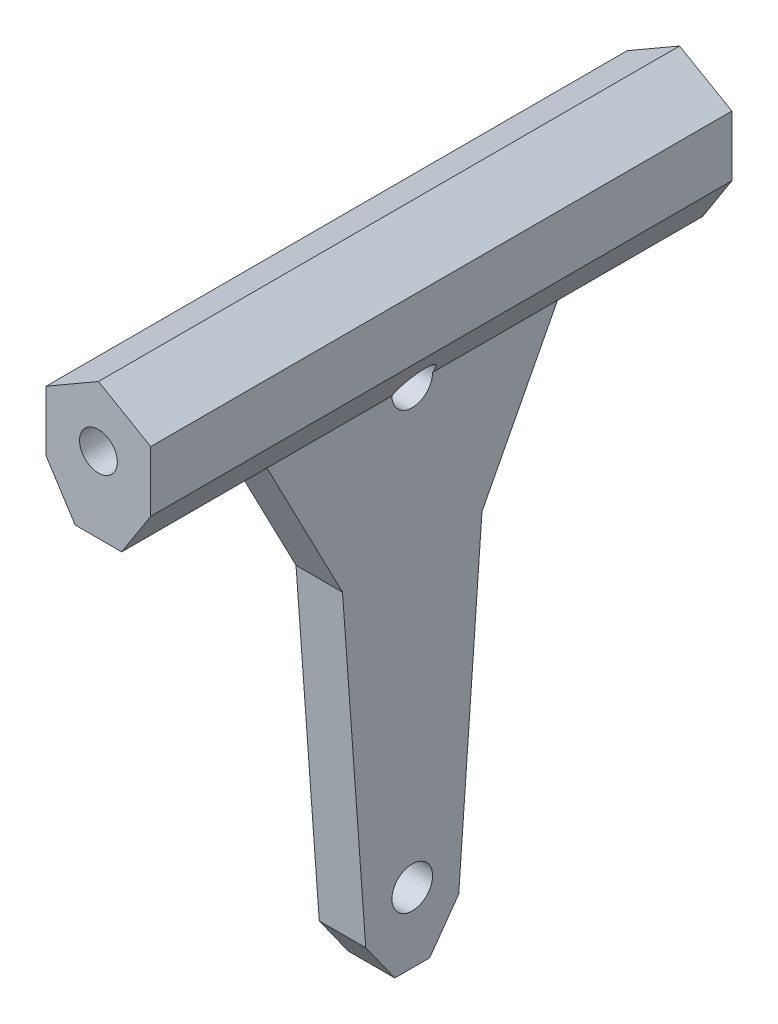
ISO-10303-21;
HEADER;
FILE_DESCRIPTION(('STEP AP214'),'2;1');
FILE_NAME('part.step','',(''),(''),'','','');
FILE_SCHEMA(('AUTOMOTIVE_DESIGN { 1 0 10303 214 1 1 1 1 }'));
ENDSEC;
DATA;
#1=APPLICATION_CONTEXT('core data for automotive mechanical design processes');
#2=APPLICATION_PROTOCOL_DEFINITION('international standard','automotive_design',2000,#1);
#3=PRODUCT_CONTEXT('',#1,'mechanical');
#4=PRODUCT('Part','Part','',(#3));
#5=PRODUCT_RELATED_PRODUCT_CATEGORY('part','',(#4));
#6=PRODUCT_DEFINITION_FORMATION('','',#4);
#7=PRODUCT_DEFINITION_CONTEXT('part definition',#1,'design');
#8=PRODUCT_DEFINITION('design','',#6,#7);
#9=PRODUCT_DEFINITION_SHAPE('','',#8);
#10=(LENGTH_UNIT() NAMED_UNIT(*) SI_UNIT(.MILLI.,.METRE.));
#11=(NAMED_UNIT(*) PLANE_ANGLE_UNIT() SI_UNIT($,.RADIAN.));
#12=(NAMED_UNIT(*) SI_UNIT($,.STERADIAN.) SOLID_ANGLE_UNIT());
#13=UNCERTAINTY_MEASURE_WITH_UNIT(LENGTH_MEASURE(1.E-05),#10,'distance_accuracy_value','');
#14=(GEOMETRIC_REPRESENTATION_CONTEXT(3) GLOBAL_UNCERTAINTY_ASSIGNED_CONTEXT((#13)) GLOBAL_UNIT_ASSIGNED_CONTEXT((#10,
#11,#12)) REPRESENTATION_CONTEXT('',''));
#15=CARTESIAN_POINT('',(0.,0.,0.));
#16=DIRECTION('',(0.,0.,1.));
#17=DIRECTION('',(1.,0.,0.));
#18=AXIS2_PLACEMENT_3D('',#15,#16,#17);
#19=CARTESIAN_POINT('',(-4.,-13.,100.));
#20=DIRECTION('',(1.,0.,0.));
#21=DIRECTION('',(0.,1.,0.));
#22=AXIS2_PLACEMENT_3D('',#19,#20,#21);
#23=PLANE('',#22);
#24=CARTESIAN_POINT('',(-3.99999999999999,-88.,50.));
#25=DIRECTION('',(1.,0.,0.));
#26=DIRECTION('',(0.,1.,0.));
#27=AXIS2_PLACEMENT_3D('',#24,#25,#26);
#28=CIRCLE('',#27,3.5);
#29=CARTESIAN_POINT('',(-3.99999999999999,-91.5,50.));
#30=VERTEX_POINT('',#29);
#31=EDGE_CURVE('E590',#30,#30,#28,.T.);
#32=ORIENTED_EDGE('',*,*,#31,.T.);
#33=EDGE_LOOP('',(#32));
#34=FACE_BOUND('',#33,.T.);
#35=DIRECTION('',(0.,0.,-1.));
#36=VECTOR('',#35,1.);
#37=CARTESIAN_POINT('',(-4.,-13.,100.));
#38=LINE('',#37,#36);
#39=CARTESIAN_POINT('',(-3.99999999999999,-13.,75.));
#40=VERTEX_POINT('',#39);
#41=CARTESIAN_POINT('',(-4.,-13.,53.5));
#42=VERTEX_POINT('',#41);
#43=EDGE_CURVE('E510',#40,#42,#38,.T.);
#44=ORIENTED_EDGE('',*,*,#43,.T.);
#45=CARTESIAN_POINT('',(-4.,-13.,50.));
#46=DIRECTION('',(1.,0.,0.));
#47=DIRECTION('',(0.,1.,0.));
#48=AXIS2_PLACEMENT_3D('',#45,#46,#47);
#49=CIRCLE('',#48,3.5);
#50=CARTESIAN_POINT('',(-4.,-13.,46.5));
#51=VERTEX_POINT('',#50);
#52=EDGE_CURVE('E576',#42,#51,#49,.T.);
#53=ORIENTED_EDGE('',*,*,#52,.T.);
#54=CARTESIAN_POINT('',(-3.99999999999999,-13.,25.));
#55=VERTEX_POINT('',#54);
#56=EDGE_CURVE('E507',#51,#55,#38,.T.);
#57=ORIENTED_EDGE('',*,*,#56,.T.);
#58=DIRECTION('',(0.,0.887216801234595,-0.46135273664199));
#59=VECTOR('',#58,1.);
#60=CARTESIAN_POINT('',(-3.99999999999999,-43.6989924433249,40.963476070529));
#61=LINE('',#60,#59);
#62=CARTESIAN_POINT('',(-3.99999999999999,-38.,38.));
#63=VERTEX_POINT('',#62);
#64=EDGE_CURVE('E581',#63,#55,#61,.T.);
#65=ORIENTED_EDGE('',*,*,#64,.F.);
#66=DIRECTION('',(0.,0.997365816958794,-0.0725356957788213));
#67=VECTOR('',#66,1.);
#68=CARTESIAN_POINT('',(-4.,-17.6169023347583,36.5175928970733));
#69=LINE('',#68,#67);
#70=CARTESIAN_POINT('',(-3.99999999999999,-93.,42.));
#71=VERTEX_POINT('',#70);
#72=EDGE_CURVE('E579',#71,#63,#69,.T.);
#73=ORIENTED_EDGE('',*,*,#72,.F.);
#74=DIRECTION('',(0.,0.813733471206736,-0.581238193719095));
#75=VECTOR('',#74,1.);
#76=CARTESIAN_POINT('',(-3.99999999999999,-67.4594594594593,23.7567567567567));
#77=LINE('',#76,#75);
#78=CARTESIAN_POINT('',(-3.99999999999998,-100.,47.));
#79=VERTEX_POINT('',#78);
#80=EDGE_CURVE('E588',#79,#71,#77,.T.);
#81=ORIENTED_EDGE('',*,*,#80,.F.);
#82=DIRECTION('',(0.,0.,-1.));
#83=VECTOR('',#82,1.);
#84=CARTESIAN_POINT('',(-3.99999999999999,-100.,100.));
#85=LINE('',#84,#83);
#86=CARTESIAN_POINT('',(-3.99999999999998,-100.,53.));
#87=VERTEX_POINT('',#86);
#88=EDGE_CURVE('E504',#87,#79,#85,.T.);
#89=ORIENTED_EDGE('',*,*,#88,.F.);
#90=DIRECTION('',(0.,-0.813733471206736,-0.581238193719095));
#91=VECTOR('',#90,1.);
#92=CARTESIAN_POINT('',(-4.,-20.162162162162,110.027027027027));
#93=LINE('',#92,#91);
#94=CARTESIAN_POINT('',(-3.99999999999999,-93.,58.));
#95=VERTEX_POINT('',#94);
#96=EDGE_CURVE('E586',#95,#87,#93,.T.);
#97=ORIENTED_EDGE('',*,*,#96,.F.);
#98=DIRECTION('',(0.,-0.997365816958794,-0.0725356957788212));
#99=VECTOR('',#98,1.);
#100=CARTESIAN_POINT('',(-4.,-10.3824399868464,64.0085498191384));
#101=LINE('',#100,#99);
#102=CARTESIAN_POINT('',(-3.99999999999999,-38.,62.));
#103=VERTEX_POINT('',#102);
#104=EDGE_CURVE('E584',#103,#95,#101,.T.);
#105=ORIENTED_EDGE('',*,*,#104,.F.);
#106=DIRECTION('',(0.,-0.887216801234595,-0.46135273664199));
#107=VECTOR('',#106,1.);
#108=CARTESIAN_POINT('',(-4.,-2.76700251889168,80.3211586901763));
#109=LINE('',#108,#107);
#110=EDGE_CURVE('E544',#40,#103,#109,.T.);
#111=ORIENTED_EDGE('',*,*,#110,.F.);
#112=EDGE_LOOP('',(#44,#53,#57,#65,#73,#81,#89,#97,#105,#111));
#113=FACE_BOUND('',#112,.T.);
#114=ADVANCED_FACE('F327',(#34,#113),#23,.F.);
#115=CARTESIAN_POINT('',(-3.99999999999999,-100.,100.));
#116=DIRECTION('',(0.,1.,0.));
#117=DIRECTION('',(0.,0.,1.));
#118=AXIS2_PLACEMENT_3D('',#115,#116,#117);
#119=PLANE('',#118);
#120=DIRECTION('',(-1.,0.,0.));
#121=VECTOR('',#120,1.);
#122=CARTESIAN_POINT('',(9.00000000000002,-100.,47.));
#123=LINE('',#122,#121);
#124=CARTESIAN_POINT('',(4.00000000000001,-100.,47.));
#125=VERTEX_POINT('',#124);
#126=EDGE_CURVE('E457',#125,#79,#123,.T.);
#127=ORIENTED_EDGE('',*,*,#126,.F.);
#128=DIRECTION('',(0.,0.,-1.));
#129=VECTOR('',#128,1.);
#130=CARTESIAN_POINT('',(4.00000000000001,-100.,100.));
#131=LINE('',#130,#129);
#132=CARTESIAN_POINT('',(4.00000000000001,-100.,53.));
#133=VERTEX_POINT('',#132);
#134=EDGE_CURVE('E500',#133,#125,#131,.T.);
#135=ORIENTED_EDGE('',*,*,#134,.F.);
#136=DIRECTION('',(-1.,0.,0.));
#137=VECTOR('',#136,1.);
#138=CARTESIAN_POINT('',(9.00000000000002,-100.,53.));
#139=LINE('',#138,#137);
#140=EDGE_CURVE('E647',#133,#87,#139,.T.);
#141=ORIENTED_EDGE('',*,*,#140,.T.);
#142=ORIENTED_EDGE('',*,*,#88,.T.);
#143=EDGE_LOOP('',(#127,#135,#141,#142));
#144=FACE_BOUND('',#143,.T.);
#145=ADVANCED_FACE('F645',(#144),#119,.F.);
#146=CARTESIAN_POINT('',(4.00000000000001,-100.,100.));
#147=DIRECTION('',(-1.,0.,0.));
#148=DIRECTION('',(0.,0.,1.));
#149=AXIS2_PLACEMENT_3D('',#146,#147,#148);
#150=PLANE('',#149);
#151=CARTESIAN_POINT('',(4.00000000000001,-88.,50.));
#152=DIRECTION('',(-1.,0.,0.));
#153=DIRECTION('',(0.,0.,1.));
#154=AXIS2_PLACEMENT_3D('',#151,#152,#153);
#155=CIRCLE('',#154,3.5);
#156=CARTESIAN_POINT('',(4.00000000000001,-91.5,50.));
#157=VERTEX_POINT('',#156);
#158=EDGE_CURVE('E331',#157,#157,#155,.T.);
#159=ORIENTED_EDGE('',*,*,#158,.T.);
#160=EDGE_LOOP('',(#159));
#161=FACE_BOUND('',#160,.T.);
#162=DIRECTION('',(0.,0.,-1.));
#163=VECTOR('',#162,1.);
#164=CARTESIAN_POINT('',(4.00000000000001,-13.,100.));
#165=LINE('',#164,#163);
#166=CARTESIAN_POINT('',(4.00000000000001,-13.,46.5));
#167=VERTEX_POINT('',#166);
#168=CARTESIAN_POINT('',(4.00000000000001,-13.,25.));
#169=VERTEX_POINT('',#168);
#170=EDGE_CURVE('E551',#167,#169,#165,.T.);
#171=ORIENTED_EDGE('',*,*,#170,.F.);
#172=CARTESIAN_POINT('',(4.00000000000001,-13.,50.));
#173=DIRECTION('',(-1.,0.,0.));
#174=DIRECTION('',(0.,0.,1.));
#175=AXIS2_PLACEMENT_3D('',#172,#173,#174);
#176=CIRCLE('',#175,3.5);
#177=CARTESIAN_POINT('',(4.00000000000001,-13.,53.5));
#178=VERTEX_POINT('',#177);
#179=EDGE_CURVE('E349',#167,#178,#176,.T.);
#180=ORIENTED_EDGE('',*,*,#179,.T.);
#181=CARTESIAN_POINT('',(4.00000000000001,-13.,75.));
#182=VERTEX_POINT('',#181);
#183=EDGE_CURVE('E501',#182,#178,#165,.T.);
#184=ORIENTED_EDGE('',*,*,#183,.F.);
#185=DIRECTION('',(0.,0.887216801234595,0.46135273664199));
#186=VECTOR('',#185,1.);
#187=CARTESIAN_POINT('',(4.00000000000001,-71.2493702770781,44.7103274559194));
#188=LINE('',#187,#186);
#189=CARTESIAN_POINT('',(4.00000000000001,-38.,62.));
#190=VERTEX_POINT('',#189);
#191=EDGE_CURVE('E523',#190,#182,#188,.T.);
#192=ORIENTED_EDGE('',*,*,#191,.F.);
#193=DIRECTION('',(0.,0.997365816958794,0.0725356957788212));
#194=VECTOR('',#193,1.);
#195=CARTESIAN_POINT('',(4.00000000000001,-96.9246958237422,57.7145675764551));
#196=LINE('',#195,#194);
#197=CARTESIAN_POINT('',(4.00000000000001,-93.,58.));
#198=VERTEX_POINT('',#197);
#199=EDGE_CURVE('E336',#198,#190,#196,.T.);
#200=ORIENTED_EDGE('',*,*,#199,.F.);
#201=DIRECTION('',(0.,0.813733471206736,0.581238193719095));
#202=VECTOR('',#201,1.);
#203=CARTESIAN_POINT('',(4.00000000000001,-77.7702702702703,68.8783783783783));
#204=LINE('',#203,#202);
#205=EDGE_CURVE('E12',#133,#198,#204,.T.);
#206=ORIENTED_EDGE('',*,*,#205,.F.);
#207=ORIENTED_EDGE('',*,*,#134,.T.);
#208=DIRECTION('',(0.,-0.813733471206736,0.581238193719095));
#209=VECTOR('',#208,1.);
#210=CARTESIAN_POINT('',(4.00000000000001,-125.067567567568,64.9054054054053));
#211=LINE('',#210,#209);
#212=CARTESIAN_POINT('',(4.00000000000001,-93.,42.));
#213=VERTEX_POINT('',#212);
#214=EDGE_CURVE('E521',#213,#125,#211,.T.);
#215=ORIENTED_EDGE('',*,*,#214,.F.);
#216=DIRECTION('',(0.,-0.997365816958794,0.0725356957788213));
#217=VECTOR('',#216,1.);
#218=CARTESIAN_POINT('',(4.00000000000001,-104.159158171654,42.8115751397567));
#219=LINE('',#218,#217);
#220=CARTESIAN_POINT('',(4.00000000000001,-38.,38.));
#221=VERTEX_POINT('',#220);
#222=EDGE_CURVE('E517',#221,#213,#219,.T.);
#223=ORIENTED_EDGE('',*,*,#222,.F.);
#224=DIRECTION('',(0.,-0.887216801234595,0.46135273664199));
#225=VECTOR('',#224,1.);
#226=CARTESIAN_POINT('',(4.00000000000001,-112.181360201511,76.5743073047859));
#227=LINE('',#226,#225);
#228=EDGE_CURVE('E519',#169,#221,#227,.T.);
#229=ORIENTED_EDGE('',*,*,#228,.F.);
#230=EDGE_LOOP('',(#171,#180,#184,#192,#200,#206,#207,#215,#223,#229));
#231=FACE_BOUND('',#230,.T.);
#232=ADVANCED_FACE('F548',(#161,#231),#150,.F.);
#233=CARTESIAN_POINT('',(0.,0.,100.));
#234=DIRECTION('',(0.,0.,1.));
#235=DIRECTION('',(1.,0.,0.));
#236=AXIS2_PLACEMENT_3D('',#233,#234,#235);
#237=PLANE('',#236);
#238=DIRECTION('',(-1.,0.,0.));
#239=VECTOR('',#238,1.);
#240=CARTESIAN_POINT('',(9.00000000000001,-13.,100.));
#241=LINE('',#240,#239);
#242=CARTESIAN_POINT('',(4.00000000000001,-13.,100.));
#243=VERTEX_POINT('',#242);
#244=CARTESIAN_POINT('',(-3.99999999999999,-13.,100.));
#245=VERTEX_POINT('',#244);
#246=EDGE_CURVE('E467',#243,#245,#241,.T.);
#247=ORIENTED_EDGE('',*,*,#246,.F.);
#248=DIRECTION('',(0.539477490803313,0.842000021921948,0.));
#249=VECTOR('',#248,1.);
#250=CARTESIAN_POINT('',(4.00000000000001,-13.,100.));
#251=LINE('',#250,#249);
#252=CARTESIAN_POINT('',(9.,-5.19615242270663,100.));
#253=VERTEX_POINT('',#252);
#254=EDGE_CURVE('E555',#243,#253,#251,.T.);
#255=ORIENTED_EDGE('',*,*,#254,.T.);
#256=DIRECTION('',(0.,1.,0.));
#257=VECTOR('',#256,1.);
#258=CARTESIAN_POINT('',(9.,-5.19615242270663,100.));
#259=LINE('',#258,#257);
#260=CARTESIAN_POINT('',(9.,5.19615242270663,100.));
#261=VERTEX_POINT('',#260);
#262=EDGE_CURVE('E605',#253,#261,#259,.T.);
#263=ORIENTED_EDGE('',*,*,#262,.T.);
#264=DIRECTION('',(-0.866025403784439,0.5,0.));
#265=VECTOR('',#264,1.);
#266=CARTESIAN_POINT('',(9.,5.19615242270663,100.));
#267=LINE('',#266,#265);
#268=CARTESIAN_POINT('',(0.,10.3923048454133,100.));
#269=VERTEX_POINT('',#268);
#270=EDGE_CURVE('E490',#261,#269,#267,.T.);
#271=ORIENTED_EDGE('',*,*,#270,.T.);
#272=DIRECTION('',(-0.866025403784439,-0.5,0.));
#273=VECTOR('',#272,1.);
#274=CARTESIAN_POINT('',(0.,10.3923048454133,100.));
#275=LINE('',#274,#273);
#276=CARTESIAN_POINT('',(-9.00000000000001,5.19615242270663,100.));
#277=VERTEX_POINT('',#276);
#278=EDGE_CURVE('E485',#269,#277,#275,.T.);
#279=ORIENTED_EDGE('',*,*,#278,.T.);
#280=DIRECTION('',(0.,-1.,0.));
#281=VECTOR('',#280,1.);
#282=CARTESIAN_POINT('',(-9.00000000000001,5.19615242270663,100.));
#283=LINE('',#282,#281);
#284=CARTESIAN_POINT('',(-9.,-5.19615242270663,100.));
#285=VERTEX_POINT('',#284);
#286=EDGE_CURVE('E601',#277,#285,#283,.T.);
#287=ORIENTED_EDGE('',*,*,#286,.T.);
#288=DIRECTION('',(0.539477490803313,-0.842000021921948,0.));
#289=VECTOR('',#288,1.);
#290=CARTESIAN_POINT('',(-9.,-5.19615242270663,100.));
#291=LINE('',#290,#289);
#292=EDGE_CURVE('E563',#285,#245,#291,.T.);
#293=ORIENTED_EDGE('',*,*,#292,.T.);
#294=EDGE_LOOP('',(#247,#255,#263,#271,#279,#287,#293));
#295=FACE_BOUND('',#294,.T.);
#296=CARTESIAN_POINT('',(0.,0.,100.));
#297=DIRECTION('',(0.,0.,1.));
#298=DIRECTION('',(1.,0.,0.));
#299=AXIS2_PLACEMENT_3D('',#296,#297,#298);
#300=CIRCLE('',#299,3.25);
#301=CARTESIAN_POINT('',(3.25,0.,100.));
#302=VERTEX_POINT('',#301);
#303=EDGE_CURVE('E594',#302,#302,#300,.T.);
#304=ORIENTED_EDGE('',*,*,#303,.F.);
#305=EDGE_LOOP('',(#304));
#306=FACE_BOUND('',#305,.T.);
#307=ADVANCED_FACE('F561',(#295,#306),#237,.T.);
#308=CARTESIAN_POINT('',(0.,0.,0.));
#309=DIRECTION('',(0.,0.,1.));
#310=DIRECTION('',(1.,0.,0.));
#311=AXIS2_PLACEMENT_3D('',#308,#309,#310);
#312=PLANE('',#311);
#313=DIRECTION('',(0.539477490803313,0.842000021921948,0.));
#314=VECTOR('',#313,1.);
#315=CARTESIAN_POINT('',(4.00000000000001,-13.,0.));
#316=LINE('',#315,#314);
#317=CARTESIAN_POINT('',(4.00000000000001,-13.,0.));
#318=VERTEX_POINT('',#317);
#319=CARTESIAN_POINT('',(9.,-5.19615242270663,0.));
#320=VERTEX_POINT('',#319);
#321=EDGE_CURVE('E466',#318,#320,#316,.T.);
#322=ORIENTED_EDGE('',*,*,#321,.F.);
#323=DIRECTION('',(-1.,0.,0.));
#324=VECTOR('',#323,1.);
#325=CARTESIAN_POINT('',(9.00000000000001,-13.,0.));
#326=LINE('',#325,#324);
#327=CARTESIAN_POINT('',(-3.99999999999999,-13.,0.));
#328=VERTEX_POINT('',#327);
#329=EDGE_CURVE('E449',#318,#328,#326,.T.);
#330=ORIENTED_EDGE('',*,*,#329,.T.);
#331=DIRECTION('',(0.539477490803313,-0.842000021921948,0.));
#332=VECTOR('',#331,1.);
#333=CARTESIAN_POINT('',(-9.,-5.19615242270663,0.));
#334=LINE('',#333,#332);
#335=CARTESIAN_POINT('',(-9.,-5.19615242270663,0.));
#336=VERTEX_POINT('',#335);
#337=EDGE_CURVE('E464',#336,#328,#334,.T.);
#338=ORIENTED_EDGE('',*,*,#337,.F.);
#339=DIRECTION('',(0.,-1.,0.));
#340=VECTOR('',#339,1.);
#341=CARTESIAN_POINT('',(-9.00000000000001,5.19615242270663,0.));
#342=LINE('',#341,#340);
#343=CARTESIAN_POINT('',(-9.00000000000001,5.19615242270663,0.));
#344=VERTEX_POINT('',#343);
#345=EDGE_CURVE('E474',#344,#336,#342,.T.);
#346=ORIENTED_EDGE('',*,*,#345,.F.);
#347=DIRECTION('',(-0.866025403784439,-0.5,0.));
#348=VECTOR('',#347,1.);
#349=CARTESIAN_POINT('',(0.,10.3923048454133,0.));
#350=LINE('',#349,#348);
#351=CARTESIAN_POINT('',(0.,10.3923048454133,0.));
#352=VERTEX_POINT('',#351);
#353=EDGE_CURVE('E478',#352,#344,#350,.T.);
#354=ORIENTED_EDGE('',*,*,#353,.F.);
#355=DIRECTION('',(-0.866025403784439,0.5,0.));
#356=VECTOR('',#355,1.);
#357=CARTESIAN_POINT('',(9.,5.19615242270663,0.));
#358=LINE('',#357,#356);
#359=CARTESIAN_POINT('',(9.,5.19615242270663,0.));
#360=VERTEX_POINT('',#359);
#361=EDGE_CURVE('E483',#360,#352,#358,.T.);
#362=ORIENTED_EDGE('',*,*,#361,.F.);
#363=DIRECTION('',(0.,1.,0.));
#364=VECTOR('',#363,1.);
#365=CARTESIAN_POINT('',(9.,-5.19615242270663,0.));
#366=LINE('',#365,#364);
#367=EDGE_CURVE('E476',#320,#360,#366,.T.);
#368=ORIENTED_EDGE('',*,*,#367,.F.);
#369=EDGE_LOOP('',(#322,#330,#338,#346,#354,#362,#368));
#370=FACE_BOUND('',#369,.T.);
#371=CARTESIAN_POINT('',(0.,0.,0.));
#372=DIRECTION('',(0.,0.,1.));
#373=DIRECTION('',(1.,0.,0.));
#374=AXIS2_PLACEMENT_3D('',#371,#372,#373);
#375=CIRCLE('',#374,3.25);
#376=CARTESIAN_POINT('',(3.25,0.,0.));
#377=VERTEX_POINT('',#376);
#378=EDGE_CURVE('E593',#377,#377,#375,.T.);
#379=ORIENTED_EDGE('',*,*,#378,.T.);
#380=EDGE_LOOP('',(#379));
#381=FACE_BOUND('',#380,.T.);
#382=ADVANCED_FACE('F462',(#370,#381),#312,.F.);
#383=CARTESIAN_POINT('',(0.,10.3923048454133,100.));
#384=DIRECTION('',(0.5,-0.866025403784439,0.));
#385=DIRECTION('',(0.866025403784439,0.5,0.));
#386=AXIS2_PLACEMENT_3D('',#383,#384,#385);
#387=PLANE('',#386);
#388=ORIENTED_EDGE('',*,*,#353,.T.);
#389=DIRECTION('',(0.,0.,-1.));
#390=VECTOR('',#389,1.);
#391=CARTESIAN_POINT('',(-9.00000000000001,5.19615242270663,100.));
#392=LINE('',#391,#390);
#393=EDGE_CURVE('E512',#277,#344,#392,.T.);
#394=ORIENTED_EDGE('',*,*,#393,.F.);
#395=ORIENTED_EDGE('',*,*,#278,.F.);
#396=DIRECTION('',(0.,0.,-1.));
#397=VECTOR('',#396,1.);
#398=CARTESIAN_POINT('',(0.,10.3923048454133,100.));
#399=LINE('',#398,#397);
#400=EDGE_CURVE('E486',#269,#352,#399,.T.);
#401=ORIENTED_EDGE('',*,*,#400,.T.);
#402=EDGE_LOOP('',(#388,#394,#395,#401));
#403=FACE_BOUND('',#402,.T.);
#404=ADVANCED_FACE('F329',(#403),#387,.F.);
#405=CARTESIAN_POINT('',(-9.00000000000001,5.19615242270663,100.));
#406=DIRECTION('',(1.,0.,0.));
#407=DIRECTION('',(0.,1.,0.));
#408=AXIS2_PLACEMENT_3D('',#405,#406,#407);
#409=PLANE('',#408);
#410=ORIENTED_EDGE('',*,*,#345,.T.);
#411=DIRECTION('',(0.,0.,-1.));
#412=VECTOR('',#411,1.);
#413=CARTESIAN_POINT('',(-9.,-5.19615242270663,100.));
#414=LINE('',#413,#412);
#415=EDGE_CURVE('E473',#285,#336,#414,.T.);
#416=ORIENTED_EDGE('',*,*,#415,.F.);
#417=ORIENTED_EDGE('',*,*,#286,.F.);
#418=ORIENTED_EDGE('',*,*,#393,.T.);
#419=EDGE_LOOP('',(#410,#416,#417,#418));
#420=FACE_BOUND('',#419,.T.);
#421=ADVANCED_FACE('F615',(#420),#409,.F.);
#422=CARTESIAN_POINT('',(-9.,-5.19615242270663,100.));
#423=DIRECTION('',(0.842000021921948,0.539477490803313,0.));
#424=DIRECTION('',(-0.539477490803313,0.842000021921948,0.));
#425=AXIS2_PLACEMENT_3D('',#422,#423,#424);
#426=PLANE('',#425);
#427=ORIENTED_EDGE('',*,*,#56,.F.);
#428=CARTESIAN_POINT('',(-4.,-13.,50.));
#429=DIRECTION('',(0.842000021921948,0.539477490803313,0.));
#430=DIRECTION('',(-0.539477490803313,0.842000021921948,0.));
#431=AXIS2_PLACEMENT_3D('',#428,#429,#430);
#432=ELLIPSE('',#431,4.15676948797567,3.5);
#433=EDGE_CURVE('E342',#51,#42,#432,.T.);
#434=ORIENTED_EDGE('',*,*,#433,.T.);
#435=ORIENTED_EDGE('',*,*,#43,.F.);
#436=EDGE_CURVE('E508',#245,#40,#38,.T.);
#437=ORIENTED_EDGE('',*,*,#436,.F.);
#438=ORIENTED_EDGE('',*,*,#292,.F.);
#439=ORIENTED_EDGE('',*,*,#415,.T.);
#440=ORIENTED_EDGE('',*,*,#337,.T.);
#441=DIRECTION('',(0.,0.,1.));
#442=VECTOR('',#441,1.);
#443=CARTESIAN_POINT('',(-4.,-13.,100.));
#444=LINE('',#443,#442);
#445=EDGE_CURVE('E446',#328,#55,#444,.T.);
#446=ORIENTED_EDGE('',*,*,#445,.T.);
#447=EDGE_LOOP('',(#427,#434,#435,#437,#438,#439,#440,#446));
#448=FACE_BOUND('',#447,.T.);
#449=ADVANCED_FACE('F470',(#448),#426,.F.);
#450=CARTESIAN_POINT('',(4.00000000000001,-13.,100.));
#451=DIRECTION('',(-0.842000021921948,0.539477490803313,0.));
#452=DIRECTION('',(-0.539477490803313,-0.842000021921949,0.));
#453=AXIS2_PLACEMENT_3D('',#450,#451,#452);
#454=PLANE('',#453);
#455=ORIENTED_EDGE('',*,*,#183,.T.);
#456=CARTESIAN_POINT('',(4.00000000000001,-13.,50.));
#457=DIRECTION('',(-0.842000021921948,0.539477490803313,0.));
#458=DIRECTION('',(-0.539477490803313,-0.842000021921949,0.));
#459=AXIS2_PLACEMENT_3D('',#456,#457,#458);
#460=ELLIPSE('',#459,4.15676948797567,3.5);
#461=EDGE_CURVE('E515',#178,#167,#460,.T.);
#462=ORIENTED_EDGE('',*,*,#461,.T.);
#463=ORIENTED_EDGE('',*,*,#170,.T.);
#464=EDGE_CURVE('E496',#169,#318,#165,.T.);
#465=ORIENTED_EDGE('',*,*,#464,.T.);
#466=ORIENTED_EDGE('',*,*,#321,.T.);
#467=DIRECTION('',(0.,0.,-1.));
#468=VECTOR('',#467,1.);
#469=CARTESIAN_POINT('',(9.,-5.19615242270663,100.));
#470=LINE('',#469,#468);
#471=EDGE_CURVE('E493',#253,#320,#470,.T.);
#472=ORIENTED_EDGE('',*,*,#471,.F.);
#473=ORIENTED_EDGE('',*,*,#254,.F.);
#474=EDGE_CURVE('E497',#243,#182,#165,.T.);
#475=ORIENTED_EDGE('',*,*,#474,.T.);
#476=EDGE_LOOP('',(#455,#462,#463,#465,#466,#472,#473,#475));
#477=FACE_BOUND('',#476,.T.);
#478=ADVANCED_FACE('F553',(#477),#454,.F.);
#479=CARTESIAN_POINT('',(9.,-5.19615242270663,100.));
#480=DIRECTION('',(-1.,0.,0.));
#481=DIRECTION('',(0.,-1.,0.));
#482=AXIS2_PLACEMENT_3D('',#479,#480,#481);
#483=PLANE('',#482);
#484=ORIENTED_EDGE('',*,*,#367,.T.);
#485=DIRECTION('',(0.,0.,-1.));
#486=VECTOR('',#485,1.);
#487=CARTESIAN_POINT('',(9.,5.19615242270663,100.));
#488=LINE('',#487,#486);
#489=EDGE_CURVE('E489',#261,#360,#488,.T.);
#490=ORIENTED_EDGE('',*,*,#489,.F.);
#491=ORIENTED_EDGE('',*,*,#262,.F.);
#492=ORIENTED_EDGE('',*,*,#471,.T.);
#493=EDGE_LOOP('',(#484,#490,#491,#492));
#494=FACE_BOUND('',#493,.T.);
#495=ADVANCED_FACE('F622',(#494),#483,.F.);
#496=CARTESIAN_POINT('',(9.,5.19615242270663,100.));
#497=DIRECTION('',(-0.5,-0.866025403784439,0.));
#498=DIRECTION('',(0.866025403784439,-0.5,0.));
#499=AXIS2_PLACEMENT_3D('',#496,#497,#498);
#500=PLANE('',#499);
#501=ORIENTED_EDGE('',*,*,#361,.T.);
#502=ORIENTED_EDGE('',*,*,#400,.F.);
#503=ORIENTED_EDGE('',*,*,#270,.F.);
#504=ORIENTED_EDGE('',*,*,#489,.T.);
#505=EDGE_LOOP('',(#501,#502,#503,#504));
#506=FACE_BOUND('',#505,.T.);
#507=ADVANCED_FACE('F620',(#506),#500,.F.);
#508=CARTESIAN_POINT('',(0.,0.,100.));
#509=DIRECTION('',(0.,0.,-1.));
#510=DIRECTION('',(-1.,0.,0.));
#511=AXIS2_PLACEMENT_3D('',#508,#509,#510);
#512=CYLINDRICAL_SURFACE('',#511,3.25);
#513=ORIENTED_EDGE('',*,*,#303,.T.);
#514=EDGE_LOOP('',(#513));
#515=FACE_BOUND('',#514,.T.);
#516=ORIENTED_EDGE('',*,*,#378,.F.);
#517=EDGE_LOOP('',(#516));
#518=FACE_BOUND('',#517,.T.);
#519=ADVANCED_FACE('F692',(#515,#518),#512,.F.);
#520=CARTESIAN_POINT('',(9.00000000000001,-13.,0.));
#521=DIRECTION('',(0.,1.,0.));
#522=DIRECTION('',(-1.,0.,0.));
#523=AXIS2_PLACEMENT_3D('',#520,#521,#522);
#524=PLANE('',#523);
#525=ORIENTED_EDGE('',*,*,#329,.F.);
#526=ORIENTED_EDGE('',*,*,#464,.F.);
#527=DIRECTION('',(-1.,0.,0.));
#528=VECTOR('',#527,1.);
#529=CARTESIAN_POINT('',(9.00000000000001,-13.,25.));
#530=LINE('',#529,#528);
#531=EDGE_CURVE('E452',#169,#55,#530,.T.);
#532=ORIENTED_EDGE('',*,*,#531,.T.);
#533=ORIENTED_EDGE('',*,*,#445,.F.);
#534=EDGE_LOOP('',(#525,#526,#532,#533));
#535=FACE_BOUND('',#534,.T.);
#536=ADVANCED_FACE('F448',(#535),#524,.F.);
#537=CARTESIAN_POINT('',(9.00000000000001,2.54916146004604,35.050970075633));
#538=DIRECTION('',(0.,-0.0725356957788213,-0.997365816958794));
#539=DIRECTION('',(0.,0.997365816958794,-0.0725356957788213));
#540=AXIS2_PLACEMENT_3D('',#537,#538,#539);
#541=PLANE('',#540);
#542=ORIENTED_EDGE('',*,*,#72,.T.);
#543=DIRECTION('',(-1.,0.,0.));
#544=VECTOR('',#543,1.);
#545=CARTESIAN_POINT('',(9.00000000000001,-38.,38.));
#546=LINE('',#545,#544);
#547=EDGE_CURVE('E569',#221,#63,#546,.T.);
#548=ORIENTED_EDGE('',*,*,#547,.F.);
#549=ORIENTED_EDGE('',*,*,#222,.T.);
#550=DIRECTION('',(-1.,0.,0.));
#551=VECTOR('',#550,1.);
#552=CARTESIAN_POINT('',(9.00000000000001,-93.,42.));
#553=LINE('',#552,#551);
#554=EDGE_CURVE('E572',#213,#71,#553,.T.);
#555=ORIENTED_EDGE('',*,*,#554,.T.);
#556=EDGE_LOOP('',(#542,#548,#549,#555));
#557=FACE_BOUND('',#556,.T.);
#558=ADVANCED_FACE('F633',(#557),#541,.T.);
#559=CARTESIAN_POINT('',(9.00000000000001,7.46599496221663,14.3576826196474));
#560=DIRECTION('',(0.,-0.46135273664199,-0.887216801234595));
#561=DIRECTION('',(0.,0.887216801234595,-0.46135273664199));
#562=AXIS2_PLACEMENT_3D('',#559,#560,#561);
#563=PLANE('',#562);
#564=ORIENTED_EDGE('',*,*,#64,.T.);
#565=ORIENTED_EDGE('',*,*,#531,.F.);
#566=ORIENTED_EDGE('',*,*,#228,.T.);
#567=ORIENTED_EDGE('',*,*,#547,.T.);
#568=EDGE_LOOP('',(#564,#565,#566,#567));
#569=FACE_BOUND('',#568,.T.);
#570=ADVANCED_FACE('F626',(#569),#563,.T.);
#571=CARTESIAN_POINT('',(9.00000000000001,-11.5540540540539,-16.1756756756755));
#572=DIRECTION('',(0.,-0.581238193719095,-0.813733471206736));
#573=DIRECTION('',(0.,0.813733471206736,-0.581238193719095));
#574=AXIS2_PLACEMENT_3D('',#571,#572,#573);
#575=PLANE('',#574);
#576=ORIENTED_EDGE('',*,*,#80,.T.);
#577=ORIENTED_EDGE('',*,*,#554,.F.);
#578=ORIENTED_EDGE('',*,*,#214,.T.);
#579=ORIENTED_EDGE('',*,*,#126,.T.);
#580=EDGE_LOOP('',(#576,#577,#578,#579));
#581=FACE_BOUND('',#580,.T.);
#582=ADVANCED_FACE('F636',(#581),#575,.T.);
#583=CARTESIAN_POINT('',(9.00000000000001,-58.8513513513511,82.3918918918919));
#584=DIRECTION('',(0.,-0.581238193719095,0.813733471206736));
#585=DIRECTION('',(0.,-0.813733471206736,-0.581238193719095));
#586=AXIS2_PLACEMENT_3D('',#583,#584,#585);
#587=PLANE('',#586);
#588=ORIENTED_EDGE('',*,*,#96,.T.);
#589=ORIENTED_EDGE('',*,*,#140,.F.);
#590=ORIENTED_EDGE('',*,*,#205,.T.);
#591=DIRECTION('',(-1.,0.,0.));
#592=VECTOR('',#591,1.);
#593=CARTESIAN_POINT('',(9.00000000000001,-93.,58.));
#594=LINE('',#593,#592);
#595=EDGE_CURVE('E535',#198,#95,#594,.T.);
#596=ORIENTED_EDGE('',*,*,#595,.T.);
#597=EDGE_LOOP('',(#588,#589,#590,#596));
#598=FACE_BOUND('',#597,.T.);
#599=ADVANCED_FACE('F652',(#598),#587,.T.);
#600=CARTESIAN_POINT('',(9.00000000000001,-4.68530088786582,64.4228872081552));
#601=DIRECTION('',(0.,-0.0725356957788212,0.997365816958794));
#602=DIRECTION('',(0.,-0.997365816958794,-0.0725356957788212));
#603=AXIS2_PLACEMENT_3D('',#600,#601,#602);
#604=PLANE('',#603);
#605=ORIENTED_EDGE('',*,*,#104,.T.);
#606=ORIENTED_EDGE('',*,*,#595,.F.);
#607=ORIENTED_EDGE('',*,*,#199,.T.);
#608=DIRECTION('',(-1.,0.,0.));
#609=VECTOR('',#608,1.);
#610=CARTESIAN_POINT('',(9.00000000000001,-38.,62.));
#611=LINE('',#610,#609);
#612=EDGE_CURVE('E532',#190,#103,#611,.T.);
#613=ORIENTED_EDGE('',*,*,#612,.T.);
#614=EDGE_LOOP('',(#605,#606,#607,#613));
#615=FACE_BOUND('',#614,.T.);
#616=ADVANCED_FACE('F531',(#615),#604,.T.);
#617=CARTESIAN_POINT('',(9.00000000000001,-33.4659949622166,64.3576826196473));
#618=DIRECTION('',(0.,-0.46135273664199,0.887216801234595));
#619=DIRECTION('',(0.,-0.887216801234595,-0.46135273664199));
#620=AXIS2_PLACEMENT_3D('',#617,#618,#619);
#621=PLANE('',#620);
#622=ORIENTED_EDGE('',*,*,#110,.T.);
#623=ORIENTED_EDGE('',*,*,#612,.F.);
#624=ORIENTED_EDGE('',*,*,#191,.T.);
#625=DIRECTION('',(-1.,0.,0.));
#626=VECTOR('',#625,1.);
#627=CARTESIAN_POINT('',(9.00000000000001,-13.,75.));
#628=LINE('',#627,#626);
#629=EDGE_CURVE('E545',#182,#40,#628,.T.);
#630=ORIENTED_EDGE('',*,*,#629,.T.);
#631=EDGE_LOOP('',(#622,#623,#624,#630));
#632=FACE_BOUND('',#631,.T.);
#633=ADVANCED_FACE('F540',(#632),#621,.T.);
#634=CARTESIAN_POINT('',(9.00000000000001,-13.,0.));
#635=DIRECTION('',(0.,1.,0.));
#636=DIRECTION('',(-1.,0.,0.));
#637=AXIS2_PLACEMENT_3D('',#634,#635,#636);
#638=PLANE('',#637);
#639=ORIENTED_EDGE('',*,*,#629,.F.);
#640=ORIENTED_EDGE('',*,*,#474,.F.);
#641=ORIENTED_EDGE('',*,*,#246,.T.);
#642=ORIENTED_EDGE('',*,*,#436,.T.);
#643=EDGE_LOOP('',(#639,#640,#641,#642));
#644=FACE_BOUND('',#643,.T.);
#645=ADVANCED_FACE('F558',(#644),#638,.F.);
#646=CARTESIAN_POINT('',(9.00000000000001,-13.,50.));
#647=DIRECTION('',(-1.,0.,0.));
#648=DIRECTION('',(0.,-1.,0.));
#649=AXIS2_PLACEMENT_3D('',#646,#647,#648);
#650=CYLINDRICAL_SURFACE('',#649,3.5);
#651=ORIENTED_EDGE('',*,*,#461,.F.);
#652=ORIENTED_EDGE('',*,*,#179,.F.);
#653=EDGE_LOOP('',(#651,#652));
#654=FACE_BOUND('',#653,.T.);
#655=ORIENTED_EDGE('',*,*,#52,.F.);
#656=ORIENTED_EDGE('',*,*,#433,.F.);
#657=EDGE_LOOP('',(#655,#656));
#658=FACE_BOUND('',#657,.T.);
#659=ADVANCED_FACE('F654',(#654,#658),#650,.F.);
#660=CARTESIAN_POINT('',(9.00000000000001,-88.,50.));
#661=DIRECTION('',(-1.,0.,0.));
#662=DIRECTION('',(0.,-1.,0.));
#663=AXIS2_PLACEMENT_3D('',#660,#661,#662);
#664=CYLINDRICAL_SURFACE('',#663,3.5);
#665=CARTESIAN_POINT('',(4.00000000000001,-91.5,50.));
#666=CARTESIAN_POINT('',(3.91666666666667,-91.5,50.));
#667=CARTESIAN_POINT('',(3.83333333333334,-91.5,50.));
#668=CARTESIAN_POINT('',(3.66666666666667,-91.5,50.));
#669=CARTESIAN_POINT('',(3.58333333333334,-91.5,50.));
#670=CARTESIAN_POINT('',(3.41666666666667,-91.5,50.));
#671=CARTESIAN_POINT('',(3.33333333333334,-91.5,50.));
#672=CARTESIAN_POINT('',(3.16666666666667,-91.5,50.));
#673=CARTESIAN_POINT('',(3.08333333333334,-91.5,50.));
#674=CARTESIAN_POINT('',(2.91666666666667,-91.5,50.));
#675=CARTESIAN_POINT('',(2.83333333333334,-91.5,50.));
#676=CARTESIAN_POINT('',(2.66666666666667,-91.5,50.));
#677=CARTESIAN_POINT('',(2.58333333333334,-91.5,50.));
#678=CARTESIAN_POINT('',(2.41666666666667,-91.5,50.));
#679=CARTESIAN_POINT('',(2.33333333333334,-91.5,50.));
#680=CARTESIAN_POINT('',(2.16666666666667,-91.5,50.));
#681=CARTESIAN_POINT('',(2.08333333333334,-91.5,50.));
#682=CARTESIAN_POINT('',(1.91666666666667,-91.5,50.));
#683=CARTESIAN_POINT('',(1.83333333333334,-91.5,50.));
#684=CARTESIAN_POINT('',(1.66666666666667,-91.5,50.));
#685=CARTESIAN_POINT('',(1.58333333333334,-91.5,50.));
#686=CARTESIAN_POINT('',(1.41666666666667,-91.5,50.));
#687=CARTESIAN_POINT('',(1.33333333333334,-91.5,50.));
#688=CARTESIAN_POINT('',(1.16666666666668,-91.5,50.));
#689=CARTESIAN_POINT('',(1.08333333333334,-91.5,50.));
#690=CARTESIAN_POINT('',(0.916666666666676,-91.5,50.));
#691=CARTESIAN_POINT('',(0.833333333333343,-91.5,50.));
#692=CARTESIAN_POINT('',(0.666666666666676,-91.5,50.));
#693=CARTESIAN_POINT('',(0.583333333333342,-91.5,50.));
#694=CARTESIAN_POINT('',(0.416666666666676,-91.5,50.));
#695=CARTESIAN_POINT('',(0.333333333333342,-91.5,50.));
#696=CARTESIAN_POINT('',(0.166666666666675,-91.5,50.));
#697=CARTESIAN_POINT('',(0.0833333333333421,-91.5,50.));
#698=CARTESIAN_POINT('',(-0.0833333333333247,-91.5,50.));
#699=CARTESIAN_POINT('',(-0.166666666666658,-91.5,50.));
#700=CARTESIAN_POINT('',(-0.333333333333324,-91.5,50.));
#701=CARTESIAN_POINT('',(-0.416666666666657,-91.5,50.));
#702=CARTESIAN_POINT('',(-0.583333333333323,-91.5,50.));
#703=CARTESIAN_POINT('',(-0.666666666666657,-91.5,50.));
#704=CARTESIAN_POINT('',(-0.833333333333323,-91.5,50.));
#705=CARTESIAN_POINT('',(-0.916666666666656,-91.5,50.));
#706=CARTESIAN_POINT('',(-1.08333333333332,-91.5,50.));
#707=CARTESIAN_POINT('',(-1.16666666666666,-91.5,50.));
#708=CARTESIAN_POINT('',(-1.33333333333332,-91.5,50.));
#709=CARTESIAN_POINT('',(-1.41666666666666,-91.5,50.));
#710=CARTESIAN_POINT('',(-1.58333333333332,-91.5,50.));
#711=CARTESIAN_POINT('',(-1.66666666666666,-91.5,50.));
#712=CARTESIAN_POINT('',(-1.83333333333332,-91.5,50.));
#713=CARTESIAN_POINT('',(-1.91666666666666,-91.5,50.));
#714=CARTESIAN_POINT('',(-2.08333333333332,-91.5,50.));
#715=CARTESIAN_POINT('',(-2.16666666666666,-91.5,50.));
#716=CARTESIAN_POINT('',(-2.33333333333332,-91.5,50.));
#717=CARTESIAN_POINT('',(-2.41666666666666,-91.5,50.));
#718=CARTESIAN_POINT('',(-2.58333333333332,-91.5,50.));
#719=CARTESIAN_POINT('',(-2.66666666666666,-91.5,50.));
#720=CARTESIAN_POINT('',(-2.83333333333332,-91.5,50.));
#721=CARTESIAN_POINT('',(-2.91666666666666,-91.5,50.));
#722=CARTESIAN_POINT('',(-3.08333333333332,-91.5,50.));
#723=CARTESIAN_POINT('',(-3.16666666666665,-91.5,50.));
#724=CARTESIAN_POINT('',(-3.33333333333332,-91.5,50.));
#725=CARTESIAN_POINT('',(-3.41666666666665,-91.5,50.));
#726=CARTESIAN_POINT('',(-3.58333333333332,-91.5,50.));
#727=CARTESIAN_POINT('',(-3.66666666666665,-91.5,50.));
#728=CARTESIAN_POINT('',(-3.83333333333332,-91.5,50.));
#729=CARTESIAN_POINT('',(-3.91666666666665,-91.5,50.));
#730=CARTESIAN_POINT('',(-3.99999999999999,-91.5,50.));
#731=B_SPLINE_CURVE_WITH_KNOTS('',3,(#665,#666,#667,#668,#669,#670,#671,#672,#673,#674,#675,
#676,#677,#678,#679,#680,#681,#682,#683,#684,#685,#686,#687,#688,#689,#690,#691,#692,#693,#694,
#695,#696,#697,#698,#699,#700,#701,#702,#703,#704,#705,#706,#707,#708,#709,#710,#711,#712,#713,
#714,#715,#716,#717,#718,#719,#720,#721,#722,#723,#724,#725,#726,#727,#728,#729,#730),
.UNSPECIFIED.,.F.,.F.,(4,2,2,2,2,2,2,2,2,2,2,2,2,2,2,2,2,2,2,2,2,2,2,2,2,2,2,2,2,2,2,2,4),(0.,
0.25,0.5,0.75,0.999999999999999,1.25,1.5,1.75,2.,2.25,2.5,2.75,3.,3.25,3.5,3.75,4.,4.25,4.5,
4.75,4.99999999999999,5.25,5.5,5.75,6.,6.25,6.5,6.74999999999999,6.99999999999999,
7.24999999999999,7.49999999999999,7.74999999999999,7.99999999999999),.UNSPECIFIED.);
#732=EDGE_CURVE('BSEAM656',#157,#30,#731,.T.);
#733=ORIENTED_EDGE('',*,*,#158,.F.);
#734=ORIENTED_EDGE('',*,*,#31,.F.);
#735=ORIENTED_EDGE('',*,*,#732,.T.);
#736=ORIENTED_EDGE('',*,*,#732,.F.);
#737=EDGE_LOOP('',(#733,#735,#734,#736));
#738=FACE_BOUND('',#737,.T.);
#739=ADVANCED_FACE('F656',(#738),#664,.F.);
#740=CLOSED_SHELL('',(#114,#145,#232,#307,#382,#404,#421,#449,#478,#495,#507,#519,#536,#558,
#570,#582,#599,#616,#633,#645,#659,#739));
#741=MANIFOLD_SOLID_BREP('B2',#740);
#742=ADVANCED_BREP_SHAPE_REPRESENTATION('',(#18,#741),#14);
#743=SHAPE_DEFINITION_REPRESENTATION(#9,#742);
ENDSEC;
END-ISO-10303-21;
